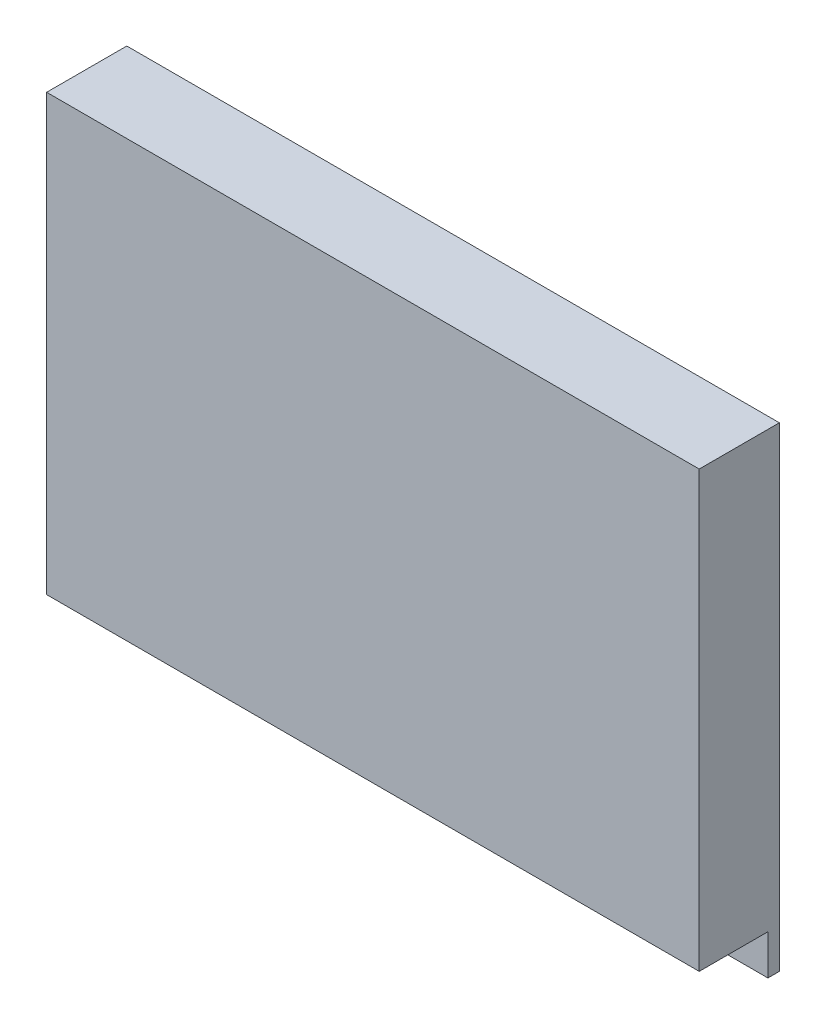
ISO-10303-21;
HEADER;
FILE_DESCRIPTION(('STEP AP214'),'2;1');
FILE_NAME('part.step','',(''),(''),'','','');
FILE_SCHEMA(('AUTOMOTIVE_DESIGN { 1 0 10303 214 1 1 1 1 }'));
ENDSEC;
DATA;
#1=APPLICATION_CONTEXT('core data for automotive mechanical design processes');
#2=APPLICATION_PROTOCOL_DEFINITION('international standard','automotive_design',2000,#1);
#3=PRODUCT_CONTEXT('',#1,'mechanical');
#4=PRODUCT('Part','Part','',(#3));
#5=PRODUCT_RELATED_PRODUCT_CATEGORY('part','',(#4));
#6=PRODUCT_DEFINITION_FORMATION('','',#4);
#7=PRODUCT_DEFINITION_CONTEXT('part definition',#1,'design');
#8=PRODUCT_DEFINITION('design','',#6,#7);
#9=PRODUCT_DEFINITION_SHAPE('','',#8);
#10=(LENGTH_UNIT() NAMED_UNIT(*) SI_UNIT(.MILLI.,.METRE.));
#11=(NAMED_UNIT(*) PLANE_ANGLE_UNIT() SI_UNIT($,.RADIAN.));
#12=(NAMED_UNIT(*) SI_UNIT($,.STERADIAN.) SOLID_ANGLE_UNIT());
#13=UNCERTAINTY_MEASURE_WITH_UNIT(LENGTH_MEASURE(1.E-05),#10,'distance_accuracy_value','');
#14=(GEOMETRIC_REPRESENTATION_CONTEXT(3) GLOBAL_UNCERTAINTY_ASSIGNED_CONTEXT((#13)) GLOBAL_UNIT_ASSIGNED_CONTEXT((#10,
#11,#12)) REPRESENTATION_CONTEXT('',''));
#15=CARTESIAN_POINT('',(0.,0.,0.));
#16=DIRECTION('',(0.,0.,1.));
#17=DIRECTION('',(1.,0.,0.));
#18=AXIS2_PLACEMENT_3D('',#15,#16,#17);
#19=CARTESIAN_POINT('',(0.,0.,1.));
#20=DIRECTION('',(0.,0.,-1.));
#21=DIRECTION('',(-1.,0.,0.));
#22=AXIS2_PLACEMENT_3D('',#19,#20,#21);
#23=PLANE('',#22);
#24=DIRECTION('',(1.,0.,0.));
#25=VECTOR('',#24,1.);
#26=CARTESIAN_POINT('',(57.,3.5,1.));
#27=LINE('',#26,#25);
#28=CARTESIAN_POINT('',(0.,3.5,1.));
#29=VERTEX_POINT('',#28);
#30=CARTESIAN_POINT('',(57.,3.5,1.));
#31=VERTEX_POINT('',#30);
#32=EDGE_CURVE('E55',#29,#31,#27,.T.);
#33=ORIENTED_EDGE('',*,*,#32,.F.);
#34=DIRECTION('',(0.,-1.,0.));
#35=VECTOR('',#34,1.);
#36=CARTESIAN_POINT('',(0.,0.,1.));
#37=LINE('',#36,#35);
#38=CARTESIAN_POINT('',(0.,0.,1.));
#39=VERTEX_POINT('',#38);
#40=EDGE_CURVE('E94',#29,#39,#37,.T.);
#41=ORIENTED_EDGE('',*,*,#40,.T.);
#42=DIRECTION('',(1.,0.,0.));
#43=VECTOR('',#42,1.);
#44=CARTESIAN_POINT('',(0.,0.,1.));
#45=LINE('',#44,#43);
#46=CARTESIAN_POINT('',(57.,0.,1.));
#47=VERTEX_POINT('',#46);
#48=EDGE_CURVE('E61',#39,#47,#45,.T.);
#49=ORIENTED_EDGE('',*,*,#48,.T.);
#50=DIRECTION('',(0.,1.,0.));
#51=VECTOR('',#50,1.);
#52=CARTESIAN_POINT('',(57.,0.,1.));
#53=LINE('',#52,#51);
#54=EDGE_CURVE('E106',#47,#31,#53,.T.);
#55=ORIENTED_EDGE('',*,*,#54,.T.);
#56=EDGE_LOOP('',(#33,#41,#49,#55));
#57=FACE_BOUND('',#56,.T.);
#58=CARTESIAN_POINT('',(10.,1.5,1.));
#59=DIRECTION('',(0.,0.,1.));
#60=DIRECTION('',(1.,0.,0.));
#61=AXIS2_PLACEMENT_3D('',#58,#59,#60);
#62=CIRCLE('',#61,0.8);
#63=CARTESIAN_POINT('',(10.8,1.5,1.));
#64=VERTEX_POINT('',#63);
#65=EDGE_CURVE('E174',#64,#64,#62,.T.);
#66=ORIENTED_EDGE('',*,*,#65,.F.);
#67=EDGE_LOOP('',(#66));
#68=FACE_BOUND('',#67,.T.);
#69=ADVANCED_FACE('F39',(#57,#68),#23,.F.);
#70=CARTESIAN_POINT('',(0.,0.,1.));
#71=DIRECTION('',(1.,0.,0.));
#72=DIRECTION('',(0.,0.,-1.));
#73=AXIS2_PLACEMENT_3D('',#70,#71,#72);
#74=PLANE('',#73);
#75=DIRECTION('',(0.,-1.,0.));
#76=VECTOR('',#75,1.);
#77=CARTESIAN_POINT('',(0.,0.,0.));
#78=LINE('',#77,#76);
#79=CARTESIAN_POINT('',(0.,41.5,0.));
#80=VERTEX_POINT('',#79);
#81=CARTESIAN_POINT('',(0.,0.,0.));
#82=VERTEX_POINT('',#81);
#83=EDGE_CURVE('E101',#80,#82,#78,.T.);
#84=ORIENTED_EDGE('',*,*,#83,.T.);
#85=DIRECTION('',(0.,0.,-1.));
#86=VECTOR('',#85,1.);
#87=CARTESIAN_POINT('',(0.,0.,1.));
#88=LINE('',#87,#86);
#89=EDGE_CURVE('E11',#39,#82,#88,.T.);
#90=ORIENTED_EDGE('',*,*,#89,.F.);
#91=ORIENTED_EDGE('',*,*,#40,.F.);
#92=DIRECTION('',(0.,0.,-1.));
#93=VECTOR('',#92,1.);
#94=CARTESIAN_POINT('',(0.,3.5,7.));
#95=LINE('',#94,#93);
#96=CARTESIAN_POINT('',(0.,3.5,7.));
#97=VERTEX_POINT('',#96);
#98=EDGE_CURVE('E111',#97,#29,#95,.T.);
#99=ORIENTED_EDGE('',*,*,#98,.F.);
#100=DIRECTION('',(0.,-1.,0.));
#101=VECTOR('',#100,1.);
#102=CARTESIAN_POINT('',(0.,3.5,7.));
#103=LINE('',#102,#101);
#104=CARTESIAN_POINT('',(0.,41.5,7.));
#105=VERTEX_POINT('',#104);
#106=EDGE_CURVE('E104',#105,#97,#103,.T.);
#107=ORIENTED_EDGE('',*,*,#106,.F.);
#108=DIRECTION('',(0.,0.,-1.));
#109=VECTOR('',#108,1.);
#110=CARTESIAN_POINT('',(0.,41.5,1.));
#111=LINE('',#110,#109);
#112=EDGE_CURVE('E86',#105,#80,#111,.T.);
#113=ORIENTED_EDGE('',*,*,#112,.T.);
#114=EDGE_LOOP('',(#84,#90,#91,#99,#107,#113));
#115=FACE_BOUND('',#114,.T.);
#116=ADVANCED_FACE('F41',(#115),#74,.F.);
#117=CARTESIAN_POINT('',(0.,0.,1.));
#118=DIRECTION('',(0.,1.,0.));
#119=DIRECTION('',(0.,0.,1.));
#120=AXIS2_PLACEMENT_3D('',#117,#118,#119);
#121=PLANE('',#120);
#122=DIRECTION('',(1.,0.,0.));
#123=VECTOR('',#122,1.);
#124=CARTESIAN_POINT('',(0.,0.,0.));
#125=LINE('',#124,#123);
#126=CARTESIAN_POINT('',(57.,0.,0.));
#127=VERTEX_POINT('',#126);
#128=EDGE_CURVE('E109',#82,#127,#125,.T.);
#129=ORIENTED_EDGE('',*,*,#128,.T.);
#130=DIRECTION('',(0.,0.,-1.));
#131=VECTOR('',#130,1.);
#132=CARTESIAN_POINT('',(57.,0.,1.));
#133=LINE('',#132,#131);
#134=EDGE_CURVE('E48',#47,#127,#133,.T.);
#135=ORIENTED_EDGE('',*,*,#134,.F.);
#136=ORIENTED_EDGE('',*,*,#48,.F.);
#137=ORIENTED_EDGE('',*,*,#89,.T.);
#138=EDGE_LOOP('',(#129,#135,#136,#137));
#139=FACE_BOUND('',#138,.T.);
#140=ADVANCED_FACE('F132',(#139),#121,.F.);
#141=CARTESIAN_POINT('',(57.,0.,1.));
#142=DIRECTION('',(-1.,0.,0.));
#143=DIRECTION('',(0.,0.,1.));
#144=AXIS2_PLACEMENT_3D('',#141,#142,#143);
#145=PLANE('',#144);
#146=DIRECTION('',(0.,1.,0.));
#147=VECTOR('',#146,1.);
#148=CARTESIAN_POINT('',(57.,0.,0.));
#149=LINE('',#148,#147);
#150=CARTESIAN_POINT('',(57.,41.5,0.));
#151=VERTEX_POINT('',#150);
#152=EDGE_CURVE('E95',#127,#151,#149,.T.);
#153=ORIENTED_EDGE('',*,*,#152,.T.);
#154=DIRECTION('',(0.,0.,-1.));
#155=VECTOR('',#154,1.);
#156=CARTESIAN_POINT('',(57.,41.5,1.));
#157=LINE('',#156,#155);
#158=CARTESIAN_POINT('',(57.,41.5,7.));
#159=VERTEX_POINT('',#158);
#160=EDGE_CURVE('E89',#159,#151,#157,.T.);
#161=ORIENTED_EDGE('',*,*,#160,.F.);
#162=DIRECTION('',(0.,1.,0.));
#163=VECTOR('',#162,1.);
#164=CARTESIAN_POINT('',(57.,3.5,7.));
#165=LINE('',#164,#163);
#166=CARTESIAN_POINT('',(57.,3.5,7.));
#167=VERTEX_POINT('',#166);
#168=EDGE_CURVE('E157',#167,#159,#165,.T.);
#169=ORIENTED_EDGE('',*,*,#168,.F.);
#170=DIRECTION('',(0.,0.,-1.));
#171=VECTOR('',#170,1.);
#172=CARTESIAN_POINT('',(57.,3.5,7.));
#173=LINE('',#172,#171);
#174=EDGE_CURVE('E117',#167,#31,#173,.T.);
#175=ORIENTED_EDGE('',*,*,#174,.T.);
#176=ORIENTED_EDGE('',*,*,#54,.F.);
#177=ORIENTED_EDGE('',*,*,#134,.T.);
#178=EDGE_LOOP('',(#153,#161,#169,#175,#176,#177));
#179=FACE_BOUND('',#178,.T.);
#180=ADVANCED_FACE('F129',(#179),#145,.F.);
#181=CARTESIAN_POINT('',(0.,41.5,1.));
#182=DIRECTION('',(0.,-1.,0.));
#183=DIRECTION('',(0.,0.,-1.));
#184=AXIS2_PLACEMENT_3D('',#181,#182,#183);
#185=PLANE('',#184);
#186=DIRECTION('',(-1.,0.,0.));
#187=VECTOR('',#186,1.);
#188=CARTESIAN_POINT('',(0.,41.5,0.));
#189=LINE('',#188,#187);
#190=EDGE_CURVE('E81',#151,#80,#189,.T.);
#191=ORIENTED_EDGE('',*,*,#190,.T.);
#192=ORIENTED_EDGE('',*,*,#112,.F.);
#193=DIRECTION('',(-1.,0.,0.));
#194=VECTOR('',#193,1.);
#195=CARTESIAN_POINT('',(57.,41.5,7.));
#196=LINE('',#195,#194);
#197=EDGE_CURVE('E152',#159,#105,#196,.T.);
#198=ORIENTED_EDGE('',*,*,#197,.F.);
#199=ORIENTED_EDGE('',*,*,#160,.T.);
#200=EDGE_LOOP('',(#191,#192,#198,#199));
#201=FACE_BOUND('',#200,.T.);
#202=ADVANCED_FACE('F83',(#201),#185,.F.);
#203=CARTESIAN_POINT('',(0.,0.,0.));
#204=DIRECTION('',(0.,0.,-1.));
#205=DIRECTION('',(-1.,0.,0.));
#206=AXIS2_PLACEMENT_3D('',#203,#204,#205);
#207=PLANE('',#206);
#208=CARTESIAN_POINT('',(10.,1.5,0.));
#209=DIRECTION('',(0.,0.,-1.));
#210=DIRECTION('',(-1.,0.,0.));
#211=AXIS2_PLACEMENT_3D('',#208,#209,#210);
#212=CIRCLE('',#211,0.8);
#213=CARTESIAN_POINT('',(9.2,1.5,0.));
#214=VERTEX_POINT('',#213);
#215=EDGE_CURVE('E158',#214,#214,#212,.T.);
#216=ORIENTED_EDGE('',*,*,#215,.F.);
#217=EDGE_LOOP('',(#216));
#218=FACE_BOUND('',#217,.T.);
#219=ORIENTED_EDGE('',*,*,#83,.F.);
#220=ORIENTED_EDGE('',*,*,#190,.F.);
#221=ORIENTED_EDGE('',*,*,#152,.F.);
#222=ORIENTED_EDGE('',*,*,#128,.F.);
#223=EDGE_LOOP('',(#219,#220,#221,#222));
#224=FACE_BOUND('',#223,.T.);
#225=ADVANCED_FACE('F108',(#218,#224),#207,.T.);
#226=CARTESIAN_POINT('',(57.,3.5,7.));
#227=DIRECTION('',(0.,1.,0.));
#228=DIRECTION('',(0.,0.,1.));
#229=AXIS2_PLACEMENT_3D('',#226,#227,#228);
#230=PLANE('',#229);
#231=ORIENTED_EDGE('',*,*,#32,.T.);
#232=ORIENTED_EDGE('',*,*,#174,.F.);
#233=DIRECTION('',(1.,0.,0.));
#234=VECTOR('',#233,1.);
#235=CARTESIAN_POINT('',(57.,3.5,7.));
#236=LINE('',#235,#234);
#237=EDGE_CURVE('E142',#97,#167,#236,.T.);
#238=ORIENTED_EDGE('',*,*,#237,.F.);
#239=ORIENTED_EDGE('',*,*,#98,.T.);
#240=EDGE_LOOP('',(#231,#232,#238,#239));
#241=FACE_BOUND('',#240,.T.);
#242=ADVANCED_FACE('F138',(#241),#230,.F.);
#243=CARTESIAN_POINT('',(0.,0.,7.));
#244=DIRECTION('',(0.,0.,1.));
#245=DIRECTION('',(1.,0.,0.));
#246=AXIS2_PLACEMENT_3D('',#243,#244,#245);
#247=PLANE('',#246);
#248=ORIENTED_EDGE('',*,*,#168,.T.);
#249=ORIENTED_EDGE('',*,*,#197,.T.);
#250=ORIENTED_EDGE('',*,*,#106,.T.);
#251=ORIENTED_EDGE('',*,*,#237,.T.);
#252=EDGE_LOOP('',(#248,#249,#250,#251));
#253=FACE_BOUND('',#252,.T.);
#254=ADVANCED_FACE('F167',(#253),#247,.T.);
#255=CARTESIAN_POINT('',(10.,1.5,1.));
#256=DIRECTION('',(0.,0.,1.));
#257=DIRECTION('',(1.,0.,0.));
#258=AXIS2_PLACEMENT_3D('',#255,#256,#257);
#259=CYLINDRICAL_SURFACE('',#258,0.8);
#260=ORIENTED_EDGE('',*,*,#65,.T.);
#261=EDGE_LOOP('',(#260));
#262=FACE_BOUND('',#261,.T.);
#263=ORIENTED_EDGE('',*,*,#215,.T.);
#264=EDGE_LOOP('',(#263));
#265=FACE_BOUND('',#264,.T.);
#266=ADVANCED_FACE('F179',(#262,#265),#259,.F.);
#267=CLOSED_SHELL('',(#69,#116,#140,#180,#202,#225,#242,#254,#266));
#268=MANIFOLD_SOLID_BREP('B2',#267);
#269=ADVANCED_BREP_SHAPE_REPRESENTATION('',(#18,#268),#14);
#270=SHAPE_DEFINITION_REPRESENTATION(#9,#269);
ENDSEC;
END-ISO-10303-21;
